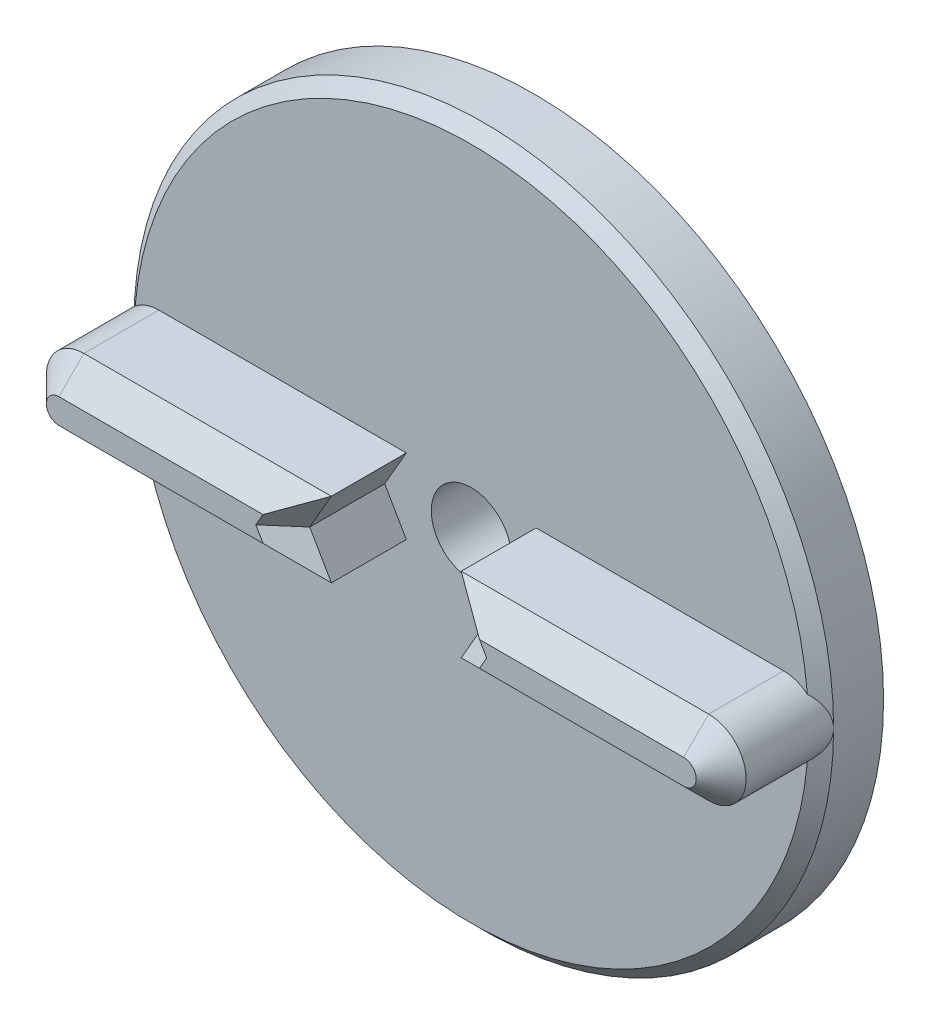
ISO-10303-21;
HEADER;
FILE_DESCRIPTION(('STEP AP214'),'2;1');
FILE_NAME('part.step','',(''),(''),'','','');
FILE_SCHEMA(('AUTOMOTIVE_DESIGN { 1 0 10303 214 1 1 1 1 }'));
ENDSEC;
DATA;
#1=APPLICATION_CONTEXT('core data for automotive mechanical design processes');
#2=APPLICATION_PROTOCOL_DEFINITION('international standard','automotive_design',2000,#1);
#3=PRODUCT_CONTEXT('',#1,'mechanical');
#4=PRODUCT('Part','Part','',(#3));
#5=PRODUCT_RELATED_PRODUCT_CATEGORY('part','',(#4));
#6=PRODUCT_DEFINITION_FORMATION('','',#4);
#7=PRODUCT_DEFINITION_CONTEXT('part definition',#1,'design');
#8=PRODUCT_DEFINITION('design','',#6,#7);
#9=PRODUCT_DEFINITION_SHAPE('','',#8);
#10=(LENGTH_UNIT() NAMED_UNIT(*) SI_UNIT(.MILLI.,.METRE.));
#11=(NAMED_UNIT(*) PLANE_ANGLE_UNIT() SI_UNIT($,.RADIAN.));
#12=(NAMED_UNIT(*) SI_UNIT($,.STERADIAN.) SOLID_ANGLE_UNIT());
#13=UNCERTAINTY_MEASURE_WITH_UNIT(LENGTH_MEASURE(1.E-05),#10,'distance_accuracy_value','');
#14=(GEOMETRIC_REPRESENTATION_CONTEXT(3) GLOBAL_UNCERTAINTY_ASSIGNED_CONTEXT((#13)) GLOBAL_UNIT_ASSIGNED_CONTEXT((#10,
#11,#12)) REPRESENTATION_CONTEXT('',''));
#15=CARTESIAN_POINT('',(0.,0.,0.));
#16=DIRECTION('',(0.,0.,1.));
#17=DIRECTION('',(1.,0.,0.));
#18=AXIS2_PLACEMENT_3D('',#15,#16,#17);
#19=CARTESIAN_POINT('',(0.,0.,-2.5));
#20=DIRECTION('',(0.,0.,1.));
#21=DIRECTION('',(1.,0.,0.));
#22=AXIS2_PLACEMENT_3D('',#19,#20,#21);
#23=CYLINDRICAL_SURFACE('',#22,1.6);
#24=DIRECTION('',(0.,0.,1.));
#25=VECTOR('',#24,1.);
#26=CARTESIAN_POINT('',(0.774596669241484,-1.4,-2.5));
#27=LINE('',#26,#25);
#28=CARTESIAN_POINT('',(0.774596669241484,-1.4,-2.));
#29=VERTEX_POINT('',#28);
#30=CARTESIAN_POINT('',(0.774596669241484,-1.4,0.));
#31=VERTEX_POINT('',#30);
#32=EDGE_CURVE('E258',#29,#31,#27,.T.);
#33=ORIENTED_EDGE('',*,*,#32,.T.);
#34=CARTESIAN_POINT('',(0.,0.,0.));
#35=DIRECTION('',(0.,0.,1.));
#36=DIRECTION('',(1.,0.,0.));
#37=AXIS2_PLACEMENT_3D('',#34,#35,#36);
#38=CIRCLE('',#37,1.6);
#39=CARTESIAN_POINT('',(-0.774596669241484,-1.4,0.));
#40=VERTEX_POINT('',#39);
#41=EDGE_CURVE('E257',#31,#40,#38,.F.);
#42=ORIENTED_EDGE('',*,*,#41,.T.);
#43=DIRECTION('',(0.,0.,1.));
#44=VECTOR('',#43,1.);
#45=CARTESIAN_POINT('',(-0.774596669241484,-1.4,-2.5));
#46=LINE('',#45,#44);
#47=CARTESIAN_POINT('',(-0.774596669241484,-1.4,-2.));
#48=VERTEX_POINT('',#47);
#49=EDGE_CURVE('E251',#40,#48,#46,.F.);
#50=ORIENTED_EDGE('',*,*,#49,.T.);
#51=CARTESIAN_POINT('',(0.,0.,-2.));
#52=DIRECTION('',(0.,0.,-1.));
#53=DIRECTION('',(-1.,0.,0.));
#54=AXIS2_PLACEMENT_3D('',#51,#52,#53);
#55=CIRCLE('',#54,1.6);
#56=CARTESIAN_POINT('',(-0.774596669241483,1.4,-2.));
#57=VERTEX_POINT('',#56);
#58=EDGE_CURVE('E390',#57,#48,#55,.F.);
#59=ORIENTED_EDGE('',*,*,#58,.F.);
#60=DIRECTION('',(0.,0.,1.));
#61=VECTOR('',#60,1.);
#62=CARTESIAN_POINT('',(-0.774596669241483,1.4,-2.5));
#63=LINE('',#62,#61);
#64=CARTESIAN_POINT('',(-0.774596669241483,1.4,0.));
#65=VERTEX_POINT('',#64);
#66=EDGE_CURVE('E253',#57,#65,#63,.T.);
#67=ORIENTED_EDGE('',*,*,#66,.T.);
#68=CARTESIAN_POINT('',(0.774596669241483,1.4,0.));
#69=VERTEX_POINT('',#68);
#70=EDGE_CURVE('E255',#65,#69,#38,.F.);
#71=ORIENTED_EDGE('',*,*,#70,.T.);
#72=DIRECTION('',(0.,0.,1.));
#73=VECTOR('',#72,1.);
#74=CARTESIAN_POINT('',(0.774596669241483,1.4,-2.5));
#75=LINE('',#74,#73);
#76=CARTESIAN_POINT('',(0.774596669241483,1.4,-2.));
#77=VERTEX_POINT('',#76);
#78=EDGE_CURVE('E260',#69,#77,#75,.F.);
#79=ORIENTED_EDGE('',*,*,#78,.T.);
#80=EDGE_CURVE('E393',#29,#77,#55,.F.);
#81=ORIENTED_EDGE('',*,*,#80,.F.);
#82=EDGE_LOOP('',(#33,#42,#50,#59,#67,#71,#79,#81));
#83=FACE_BOUND('',#82,.T.);
#84=CARTESIAN_POINT('',(0.,0.,2.5));
#85=DIRECTION('',(0.,0.,1.));
#86=DIRECTION('',(1.,0.,0.));
#87=AXIS2_PLACEMENT_3D('',#84,#85,#86);
#88=CIRCLE('',#87,1.6);
#89=CARTESIAN_POINT('',(1.6,0.,2.5));
#90=VERTEX_POINT('',#89);
#91=EDGE_CURVE('E262',#90,#90,#88,.F.);
#92=ORIENTED_EDGE('',*,*,#91,.F.);
#93=EDGE_LOOP('',(#92));
#94=FACE_BOUND('',#93,.T.);
#95=ADVANCED_FACE('F32',(#83,#94),#23,.F.);
#96=CARTESIAN_POINT('',(-12.5,-1.5,6.5));
#97=DIRECTION('',(0.,1.,0.));
#98=DIRECTION('',(-1.,0.,0.));
#99=AXIS2_PLACEMENT_3D('',#96,#97,#98);
#100=PLANE('',#99);
#101=DIRECTION('',(0.,0.,1.));
#102=VECTOR('',#101,1.);
#103=CARTESIAN_POINT('',(-2.59807621135332,-1.5,6.5));
#104=LINE('',#103,#102);
#105=CARTESIAN_POINT('',(-2.59807621135332,-1.5,2.5));
#106=VERTEX_POINT('',#105);
#107=CARTESIAN_POINT('',(-2.59807621135332,-1.5,5.5));
#108=VERTEX_POINT('',#107);
#109=EDGE_CURVE('E246',#106,#108,#104,.T.);
#110=ORIENTED_EDGE('',*,*,#109,.T.);
#111=DIRECTION('',(-1.,0.,0.));
#112=VECTOR('',#111,1.);
#113=CARTESIAN_POINT('',(-12.5,-1.5,5.5));
#114=LINE('',#113,#112);
#115=CARTESIAN_POINT('',(-12.5,-1.5,5.5));
#116=VERTEX_POINT('',#115);
#117=EDGE_CURVE('E425',#108,#116,#114,.T.);
#118=ORIENTED_EDGE('',*,*,#117,.T.);
#119=DIRECTION('',(0.,0.,-1.));
#120=VECTOR('',#119,1.);
#121=CARTESIAN_POINT('',(-12.5,-1.5,6.5));
#122=LINE('',#121,#120);
#123=CARTESIAN_POINT('',(-12.5,-1.5,2.5));
#124=VERTEX_POINT('',#123);
#125=EDGE_CURVE('E324',#116,#124,#122,.T.);
#126=ORIENTED_EDGE('',*,*,#125,.T.);
#127=DIRECTION('',(1.,0.,0.));
#128=VECTOR('',#127,1.);
#129=CARTESIAN_POINT('',(-12.5,-1.5,2.5));
#130=LINE('',#129,#128);
#131=EDGE_CURVE('E308',#124,#106,#130,.T.);
#132=ORIENTED_EDGE('',*,*,#131,.T.);
#133=EDGE_LOOP('',(#110,#118,#126,#132));
#134=FACE_BOUND('',#133,.T.);
#135=ADVANCED_FACE('F475',(#134),#100,.F.);
#136=DIRECTION('',(0.,0.,-1.));
#137=VECTOR('',#136,1.);
#138=CARTESIAN_POINT('',(12.5,-1.5,6.5));
#139=LINE('',#138,#137);
#140=CARTESIAN_POINT('',(12.5,-1.5,5.5));
#141=VERTEX_POINT('',#140);
#142=CARTESIAN_POINT('',(12.5,-1.5,2.5));
#143=VERTEX_POINT('',#142);
#144=EDGE_CURVE('E322',#141,#143,#139,.T.);
#145=ORIENTED_EDGE('',*,*,#144,.F.);
#146=DIRECTION('',(-1.,0.,0.));
#147=VECTOR('',#146,1.);
#148=CARTESIAN_POINT('',(2.59807621135332,-1.5,5.5));
#149=LINE('',#148,#147);
#150=CARTESIAN_POINT('',(2.59807621135332,-1.5,5.5));
#151=VERTEX_POINT('',#150);
#152=EDGE_CURVE('E411',#141,#151,#149,.T.);
#153=ORIENTED_EDGE('',*,*,#152,.T.);
#154=DIRECTION('',(0.,0.,-1.));
#155=VECTOR('',#154,1.);
#156=CARTESIAN_POINT('',(2.59807621135332,-1.5,6.5));
#157=LINE('',#156,#155);
#158=CARTESIAN_POINT('',(2.59807621135332,-1.5,2.5));
#159=VERTEX_POINT('',#158);
#160=EDGE_CURVE('E244',#151,#159,#157,.T.);
#161=ORIENTED_EDGE('',*,*,#160,.T.);
#162=EDGE_CURVE('E226',#159,#143,#130,.T.);
#163=ORIENTED_EDGE('',*,*,#162,.T.);
#164=EDGE_LOOP('',(#145,#153,#161,#163));
#165=FACE_BOUND('',#164,.T.);
#166=ADVANCED_FACE('F521',(#165),#100,.F.);
#167=CARTESIAN_POINT('',(-12.5,1.5,6.5));
#168=DIRECTION('',(0.,-1.,0.));
#169=DIRECTION('',(1.,0.,0.));
#170=AXIS2_PLACEMENT_3D('',#167,#168,#169);
#171=PLANE('',#170);
#172=DIRECTION('',(0.,0.,1.));
#173=VECTOR('',#172,1.);
#174=CARTESIAN_POINT('',(2.59807621135331,1.5,6.5));
#175=LINE('',#174,#173);
#176=CARTESIAN_POINT('',(2.59807621135331,1.5,2.5));
#177=VERTEX_POINT('',#176);
#178=CARTESIAN_POINT('',(2.59807621135331,1.5,5.5));
#179=VERTEX_POINT('',#178);
#180=EDGE_CURVE('E215',#177,#179,#175,.T.);
#181=ORIENTED_EDGE('',*,*,#180,.T.);
#182=DIRECTION('',(1.,0.,0.));
#183=VECTOR('',#182,1.);
#184=CARTESIAN_POINT('',(12.5,1.5,5.5));
#185=LINE('',#184,#183);
#186=CARTESIAN_POINT('',(12.5,1.5,5.5));
#187=VERTEX_POINT('',#186);
#188=EDGE_CURVE('E407',#179,#187,#185,.T.);
#189=ORIENTED_EDGE('',*,*,#188,.T.);
#190=DIRECTION('',(0.,0.,-1.));
#191=VECTOR('',#190,1.);
#192=CARTESIAN_POINT('',(12.5,1.5,6.5));
#193=LINE('',#192,#191);
#194=CARTESIAN_POINT('',(12.5,1.5,2.5));
#195=VERTEX_POINT('',#194);
#196=EDGE_CURVE('E320',#187,#195,#193,.T.);
#197=ORIENTED_EDGE('',*,*,#196,.T.);
#198=DIRECTION('',(-1.,0.,0.));
#199=VECTOR('',#198,1.);
#200=CARTESIAN_POINT('',(-12.5,1.5,2.5));
#201=LINE('',#200,#199);
#202=EDGE_CURVE('E316',#195,#177,#201,.T.);
#203=ORIENTED_EDGE('',*,*,#202,.T.);
#204=EDGE_LOOP('',(#181,#189,#197,#203));
#205=FACE_BOUND('',#204,.T.);
#206=ADVANCED_FACE('F548',(#205),#171,.F.);
#207=DIRECTION('',(0.,0.,-1.));
#208=VECTOR('',#207,1.);
#209=CARTESIAN_POINT('',(-12.5,1.5,6.5));
#210=LINE('',#209,#208);
#211=CARTESIAN_POINT('',(-12.5,1.5,5.5));
#212=VERTEX_POINT('',#211);
#213=CARTESIAN_POINT('',(-12.5,1.5,2.5));
#214=VERTEX_POINT('',#213);
#215=EDGE_CURVE('E318',#212,#214,#210,.T.);
#216=ORIENTED_EDGE('',*,*,#215,.F.);
#217=DIRECTION('',(1.,0.,0.));
#218=VECTOR('',#217,1.);
#219=CARTESIAN_POINT('',(-2.59807621135331,1.5,5.5));
#220=LINE('',#219,#218);
#221=CARTESIAN_POINT('',(-2.59807621135331,1.5,5.5));
#222=VERTEX_POINT('',#221);
#223=EDGE_CURVE('E56',#212,#222,#220,.T.);
#224=ORIENTED_EDGE('',*,*,#223,.T.);
#225=DIRECTION('',(0.,0.,-1.));
#226=VECTOR('',#225,1.);
#227=CARTESIAN_POINT('',(-2.59807621135331,1.5,6.5));
#228=LINE('',#227,#226);
#229=CARTESIAN_POINT('',(-2.59807621135332,1.5,2.5));
#230=VERTEX_POINT('',#229);
#231=EDGE_CURVE('E249',#222,#230,#228,.T.);
#232=ORIENTED_EDGE('',*,*,#231,.T.);
#233=EDGE_CURVE('E314',#230,#214,#201,.T.);
#234=ORIENTED_EDGE('',*,*,#233,.T.);
#235=EDGE_LOOP('',(#216,#224,#232,#234));
#236=FACE_BOUND('',#235,.T.);
#237=ADVANCED_FACE('F484',(#236),#171,.F.);
#238=CARTESIAN_POINT('',(-12.5,0.,6.5));
#239=DIRECTION('',(0.,0.,1.));
#240=DIRECTION('',(1.,0.,0.));
#241=AXIS2_PLACEMENT_3D('',#238,#239,#240);
#242=PLANE('',#241);
#243=CARTESIAN_POINT('',(-12.5,0.,6.5));
#244=DIRECTION('',(0.,0.,1.));
#245=DIRECTION('',(1.,0.,0.));
#246=AXIS2_PLACEMENT_3D('',#243,#244,#245);
#247=CIRCLE('',#246,0.499999999999995);
#248=CARTESIAN_POINT('',(-12.5,0.499999999999995,6.5));
#249=VERTEX_POINT('',#248);
#250=CARTESIAN_POINT('',(-12.5,-0.5,6.5));
#251=VERTEX_POINT('',#250);
#252=EDGE_CURVE('E420',#249,#251,#247,.T.);
#253=ORIENTED_EDGE('',*,*,#252,.T.);
#254=DIRECTION('',(1.,0.,0.));
#255=VECTOR('',#254,1.);
#256=CARTESIAN_POINT('',(-2.59807621135331,-0.499999999999993,6.5));
#257=LINE('',#256,#255);
#258=CARTESIAN_POINT('',(-4.3301270189222,-0.499999999999994,6.5));
#259=VERTEX_POINT('',#258);
#260=EDGE_CURVE('E422',#251,#259,#257,.T.);
#261=ORIENTED_EDGE('',*,*,#260,.T.);
#262=DIRECTION('',(-0.5,0.866025403784439,0.));
#263=VECTOR('',#262,1.);
#264=CARTESIAN_POINT('',(-4.3301270189222,-0.500000000000002,6.5));
#265=LINE('',#264,#263);
#266=CARTESIAN_POINT('',(-4.61880215351701,0.,6.5));
#267=VERTEX_POINT('',#266);
#268=EDGE_CURVE('E414',#259,#267,#265,.T.);
#269=ORIENTED_EDGE('',*,*,#268,.T.);
#270=DIRECTION('',(0.5,0.866025403784439,0.));
#271=VECTOR('',#270,1.);
#272=CARTESIAN_POINT('',(-3.46410161513776,2.00000000000001,6.5));
#273=LINE('',#272,#271);
#274=CARTESIAN_POINT('',(-4.3301270189222,0.499999999999997,6.5));
#275=VERTEX_POINT('',#274);
#276=EDGE_CURVE('E416',#267,#275,#273,.T.);
#277=ORIENTED_EDGE('',*,*,#276,.T.);
#278=DIRECTION('',(-1.,0.,0.));
#279=VECTOR('',#278,1.);
#280=CARTESIAN_POINT('',(-12.5,0.499999999999995,6.5));
#281=LINE('',#280,#279);
#282=EDGE_CURVE('E418',#275,#249,#281,.T.);
#283=ORIENTED_EDGE('',*,*,#282,.T.);
#284=EDGE_LOOP('',(#253,#261,#269,#277,#283));
#285=FACE_BOUND('',#284,.T.);
#286=ADVANCED_FACE('F462',(#285),#242,.T.);
#287=CARTESIAN_POINT('',(4.4,1.4,-2.));
#288=DIRECTION('',(0.,-1.,0.));
#289=DIRECTION('',(0.,0.,-1.));
#290=AXIS2_PLACEMENT_3D('',#287,#288,#289);
#291=PLANE('',#290);
#292=ORIENTED_EDGE('',*,*,#78,.F.);
#293=DIRECTION('',(1.,0.,0.));
#294=VECTOR('',#293,1.);
#295=CARTESIAN_POINT('',(4.4,1.4,0.));
#296=LINE('',#295,#294);
#297=CARTESIAN_POINT('',(4.4,1.4,0.));
#298=VERTEX_POINT('',#297);
#299=EDGE_CURVE('E283',#69,#298,#296,.T.);
#300=ORIENTED_EDGE('',*,*,#299,.T.);
#301=DIRECTION('',(0.,0.,1.));
#302=VECTOR('',#301,1.);
#303=CARTESIAN_POINT('',(4.4,1.4,-2.));
#304=LINE('',#303,#302);
#305=CARTESIAN_POINT('',(4.4,1.4,-2.));
#306=VERTEX_POINT('',#305);
#307=EDGE_CURVE('E298',#306,#298,#304,.T.);
#308=ORIENTED_EDGE('',*,*,#307,.F.);
#309=DIRECTION('',(1.,0.,0.));
#310=VECTOR('',#309,1.);
#311=CARTESIAN_POINT('',(4.4,1.4,-2.));
#312=LINE('',#311,#310);
#313=EDGE_CURVE('E269',#77,#306,#312,.T.);
#314=ORIENTED_EDGE('',*,*,#313,.F.);
#315=EDGE_LOOP('',(#292,#300,#308,#314));
#316=FACE_BOUND('',#315,.T.);
#317=ADVANCED_FACE('F537',(#316),#291,.F.);
#318=ORIENTED_EDGE('',*,*,#66,.F.);
#319=CARTESIAN_POINT('',(-4.4,1.4,-2.));
#320=VERTEX_POINT('',#319);
#321=EDGE_CURVE('E271',#320,#57,#312,.T.);
#322=ORIENTED_EDGE('',*,*,#321,.F.);
#323=DIRECTION('',(0.,0.,1.));
#324=VECTOR('',#323,1.);
#325=CARTESIAN_POINT('',(-4.4,1.4,-2.));
#326=LINE('',#325,#324);
#327=CARTESIAN_POINT('',(-4.4,1.4,0.));
#328=VERTEX_POINT('',#327);
#329=EDGE_CURVE('E301',#320,#328,#326,.T.);
#330=ORIENTED_EDGE('',*,*,#329,.T.);
#331=EDGE_CURVE('E284',#328,#65,#296,.T.);
#332=ORIENTED_EDGE('',*,*,#331,.T.);
#333=EDGE_LOOP('',(#318,#322,#330,#332));
#334=FACE_BOUND('',#333,.T.);
#335=ADVANCED_FACE('F532',(#334),#291,.F.);
#336=CARTESIAN_POINT('',(4.4,-1.4,-2.));
#337=DIRECTION('',(0.,1.,0.));
#338=DIRECTION('',(0.,0.,1.));
#339=AXIS2_PLACEMENT_3D('',#336,#337,#338);
#340=PLANE('',#339);
#341=ORIENTED_EDGE('',*,*,#49,.F.);
#342=DIRECTION('',(-1.,0.,0.));
#343=VECTOR('',#342,1.);
#344=CARTESIAN_POINT('',(4.4,-1.4,0.));
#345=LINE('',#344,#343);
#346=CARTESIAN_POINT('',(-4.4,-1.4,0.));
#347=VERTEX_POINT('',#346);
#348=EDGE_CURVE('E290',#40,#347,#345,.T.);
#349=ORIENTED_EDGE('',*,*,#348,.T.);
#350=DIRECTION('',(0.,0.,1.));
#351=VECTOR('',#350,1.);
#352=CARTESIAN_POINT('',(-4.4,-1.4,-2.));
#353=LINE('',#352,#351);
#354=CARTESIAN_POINT('',(-4.4,-1.4,-2.));
#355=VERTEX_POINT('',#354);
#356=EDGE_CURVE('E280',#355,#347,#353,.T.);
#357=ORIENTED_EDGE('',*,*,#356,.F.);
#358=DIRECTION('',(-1.,0.,0.));
#359=VECTOR('',#358,1.);
#360=CARTESIAN_POINT('',(4.4,-1.4,-2.));
#361=LINE('',#360,#359);
#362=EDGE_CURVE('E276',#48,#355,#361,.T.);
#363=ORIENTED_EDGE('',*,*,#362,.F.);
#364=EDGE_LOOP('',(#341,#349,#357,#363));
#365=FACE_BOUND('',#364,.T.);
#366=ADVANCED_FACE('F529',(#365),#340,.F.);
#367=ORIENTED_EDGE('',*,*,#32,.F.);
#368=CARTESIAN_POINT('',(4.4,-1.4,-2.));
#369=VERTEX_POINT('',#368);
#370=EDGE_CURVE('E277',#369,#29,#361,.T.);
#371=ORIENTED_EDGE('',*,*,#370,.F.);
#372=DIRECTION('',(0.,0.,1.));
#373=VECTOR('',#372,1.);
#374=CARTESIAN_POINT('',(4.4,-1.4,-2.));
#375=LINE('',#374,#373);
#376=CARTESIAN_POINT('',(4.4,-1.4,0.));
#377=VERTEX_POINT('',#376);
#378=EDGE_CURVE('E295',#369,#377,#375,.T.);
#379=ORIENTED_EDGE('',*,*,#378,.T.);
#380=EDGE_CURVE('E270',#377,#31,#345,.T.);
#381=ORIENTED_EDGE('',*,*,#380,.T.);
#382=EDGE_LOOP('',(#367,#371,#379,#381));
#383=FACE_BOUND('',#382,.T.);
#384=ADVANCED_FACE('F510',(#383),#340,.F.);
#385=CARTESIAN_POINT('',(0.,0.,-2.));
#386=DIRECTION('',(0.,0.,-1.));
#387=DIRECTION('',(-1.,0.,0.));
#388=AXIS2_PLACEMENT_3D('',#385,#386,#387);
#389=PLANE('',#388);
#390=ORIENTED_EDGE('',*,*,#370,.T.);
#391=ORIENTED_EDGE('',*,*,#80,.T.);
#392=ORIENTED_EDGE('',*,*,#313,.T.);
#393=DIRECTION('',(0.,-1.,0.));
#394=VECTOR('',#393,1.);
#395=CARTESIAN_POINT('',(4.4,1.4,-2.));
#396=LINE('',#395,#394);
#397=EDGE_CURVE('E274',#306,#369,#396,.T.);
#398=ORIENTED_EDGE('',*,*,#397,.T.);
#399=EDGE_LOOP('',(#390,#391,#392,#398));
#400=FACE_BOUND('',#399,.T.);
#401=ADVANCED_FACE('F505',(#400),#389,.T.);
#402=CARTESIAN_POINT('',(0.,0.,0.));
#403=DIRECTION('',(0.,0.,1.));
#404=DIRECTION('',(1.,0.,0.));
#405=AXIS2_PLACEMENT_3D('',#402,#403,#404);
#406=PLANE('',#405);
#407=ORIENTED_EDGE('',*,*,#41,.F.);
#408=ORIENTED_EDGE('',*,*,#380,.F.);
#409=DIRECTION('',(0.,-1.,0.));
#410=VECTOR('',#409,1.);
#411=CARTESIAN_POINT('',(4.4,1.4,0.));
#412=LINE('',#411,#410);
#413=EDGE_CURVE('E287',#298,#377,#412,.T.);
#414=ORIENTED_EDGE('',*,*,#413,.F.);
#415=ORIENTED_EDGE('',*,*,#299,.F.);
#416=ORIENTED_EDGE('',*,*,#70,.F.);
#417=ORIENTED_EDGE('',*,*,#331,.F.);
#418=DIRECTION('',(0.,1.,0.));
#419=VECTOR('',#418,1.);
#420=CARTESIAN_POINT('',(-4.4,1.4,0.));
#421=LINE('',#420,#419);
#422=EDGE_CURVE('E265',#347,#328,#421,.T.);
#423=ORIENTED_EDGE('',*,*,#422,.F.);
#424=ORIENTED_EDGE('',*,*,#348,.F.);
#425=EDGE_LOOP('',(#407,#408,#414,#415,#416,#417,#423,#424));
#426=FACE_BOUND('',#425,.T.);
#427=CARTESIAN_POINT('',(0.,0.,0.));
#428=DIRECTION('',(0.,0.,1.));
#429=DIRECTION('',(1.,0.,0.));
#430=AXIS2_PLACEMENT_3D('',#427,#428,#429);
#431=CIRCLE('',#430,14.);
#432=CARTESIAN_POINT('',(14.,0.,0.));
#433=VERTEX_POINT('',#432);
#434=EDGE_CURVE('E326',#433,#433,#431,.T.);
#435=ORIENTED_EDGE('',*,*,#434,.F.);
#436=EDGE_LOOP('',(#435));
#437=FACE_BOUND('',#436,.T.);
#438=ADVANCED_FACE('F501',(#426,#437),#406,.F.);
#439=CARTESIAN_POINT('',(0.,0.,2.5));
#440=DIRECTION('',(0.,0.,-1.));
#441=DIRECTION('',(-1.,0.,0.));
#442=AXIS2_PLACEMENT_3D('',#439,#440,#441);
#443=CYLINDRICAL_SURFACE('',#442,14.);
#444=CARTESIAN_POINT('',(0.,0.,2.));
#445=DIRECTION('',(0.,0.,1.));
#446=DIRECTION('',(1.,0.,0.));
#447=AXIS2_PLACEMENT_3D('',#444,#445,#446);
#448=CIRCLE('',#447,14.);
#449=CARTESIAN_POINT('',(14.,0.,2.));
#450=VERTEX_POINT('',#449);
#451=CARTESIAN_POINT('',(-14.,0.,2.));
#452=VERTEX_POINT('',#451);
#453=EDGE_CURVE('E332',#450,#452,#448,.F.);
#454=ORIENTED_EDGE('',*,*,#453,.T.);
#455=CARTESIAN_POINT('',(0.,0.,2.));
#456=DIRECTION('',(0.,0.,1.));
#457=DIRECTION('',(1.,0.,0.));
#458=AXIS2_PLACEMENT_3D('',#455,#456,#457);
#459=CIRCLE('',#458,14.);
#460=EDGE_CURVE('E334',#452,#450,#459,.F.);
#461=ORIENTED_EDGE('',*,*,#460,.T.);
#462=EDGE_LOOP('',(#454,#461));
#463=FACE_BOUND('',#462,.T.);
#464=ORIENTED_EDGE('',*,*,#434,.T.);
#465=EDGE_LOOP('',(#464));
#466=FACE_BOUND('',#465,.T.);
#467=ADVANCED_FACE('F367',(#463,#466),#443,.T.);
#468=CARTESIAN_POINT('',(0.,0.,2.5));
#469=DIRECTION('',(0.,0.,1.));
#470=DIRECTION('',(1.,0.,0.));
#471=AXIS2_PLACEMENT_3D('',#468,#469,#470);
#472=PLANE('',#471);
#473=ORIENTED_EDGE('',*,*,#91,.T.);
#474=EDGE_LOOP('',(#473));
#475=FACE_BOUND('',#474,.T.);
#476=ORIENTED_EDGE('',*,*,#162,.F.);
#477=DIRECTION('',(-0.5,-0.866025403784439,0.));
#478=VECTOR('',#477,1.);
#479=CARTESIAN_POINT('',(1.73205080756888,-3.,2.5));
#480=LINE('',#479,#478);
#481=CARTESIAN_POINT('',(3.46410161513776,0.,2.5));
#482=VERTEX_POINT('',#481);
#483=EDGE_CURVE('E219',#482,#159,#480,.T.);
#484=ORIENTED_EDGE('',*,*,#483,.F.);
#485=DIRECTION('',(0.5,-0.866025403784438,0.));
#486=VECTOR('',#485,1.);
#487=CARTESIAN_POINT('',(3.46410161513776,0.,2.5));
#488=LINE('',#487,#486);
#489=EDGE_CURVE('E207',#177,#482,#488,.T.);
#490=ORIENTED_EDGE('',*,*,#489,.F.);
#491=ORIENTED_EDGE('',*,*,#202,.F.);
#492=CARTESIAN_POINT('',(12.5,0.,2.5));
#493=DIRECTION('',(0.,0.,1.));
#494=DIRECTION('',(1.,0.,0.));
#495=AXIS2_PLACEMENT_3D('',#492,#493,#494);
#496=CIRCLE('',#495,1.5);
#497=CARTESIAN_POINT('',(13.45,1.16081867662438,2.5));
#498=VERTEX_POINT('',#497);
#499=EDGE_CURVE('E315',#498,#195,#496,.T.);
#500=ORIENTED_EDGE('',*,*,#499,.F.);
#501=CARTESIAN_POINT('',(0.,0.,2.5));
#502=DIRECTION('',(0.,0.,1.));
#503=DIRECTION('',(1.,0.,0.));
#504=AXIS2_PLACEMENT_3D('',#501,#502,#503);
#505=CIRCLE('',#504,13.5);
#506=CARTESIAN_POINT('',(-13.45,1.16081867662438,2.5));
#507=VERTEX_POINT('',#506);
#508=EDGE_CURVE('E329',#498,#507,#505,.T.);
#509=ORIENTED_EDGE('',*,*,#508,.T.);
#510=CARTESIAN_POINT('',(-12.5,0.,2.5));
#511=DIRECTION('',(0.,0.,1.));
#512=DIRECTION('',(1.,0.,0.));
#513=AXIS2_PLACEMENT_3D('',#510,#511,#512);
#514=CIRCLE('',#513,1.5);
#515=EDGE_CURVE('E304',#214,#507,#514,.T.);
#516=ORIENTED_EDGE('',*,*,#515,.F.);
#517=ORIENTED_EDGE('',*,*,#233,.F.);
#518=DIRECTION('',(0.5,0.866025403784439,0.));
#519=VECTOR('',#518,1.);
#520=CARTESIAN_POINT('',(-1.73205080756888,3.,2.5));
#521=LINE('',#520,#519);
#522=CARTESIAN_POINT('',(-3.46410161513776,0.,2.5));
#523=VERTEX_POINT('',#522);
#524=EDGE_CURVE('E237',#523,#230,#521,.T.);
#525=ORIENTED_EDGE('',*,*,#524,.F.);
#526=DIRECTION('',(-0.5,0.866025403784438,0.));
#527=VECTOR('',#526,1.);
#528=CARTESIAN_POINT('',(-3.46410161513776,0.,2.5));
#529=LINE('',#528,#527);
#530=EDGE_CURVE('E229',#106,#523,#529,.T.);
#531=ORIENTED_EDGE('',*,*,#530,.F.);
#532=ORIENTED_EDGE('',*,*,#131,.F.);
#533=CARTESIAN_POINT('',(-13.45,-1.16081867662439,2.5));
#534=VERTEX_POINT('',#533);
#535=EDGE_CURVE('E307',#534,#124,#514,.T.);
#536=ORIENTED_EDGE('',*,*,#535,.F.);
#537=CARTESIAN_POINT('',(0.,0.,2.5));
#538=DIRECTION('',(0.,0.,1.));
#539=DIRECTION('',(1.,0.,0.));
#540=AXIS2_PLACEMENT_3D('',#537,#538,#539);
#541=CIRCLE('',#540,13.5);
#542=CARTESIAN_POINT('',(13.45,-1.16081867662439,2.5));
#543=VERTEX_POINT('',#542);
#544=EDGE_CURVE('E337',#534,#543,#541,.T.);
#545=ORIENTED_EDGE('',*,*,#544,.T.);
#546=EDGE_CURVE('E311',#143,#543,#496,.T.);
#547=ORIENTED_EDGE('',*,*,#546,.F.);
#548=EDGE_LOOP('',(#476,#484,#490,#491,#500,#509,#516,#517,#525,#531,#532,#536,#545,#547));
#549=FACE_BOUND('',#548,.T.);
#550=ADVANCED_FACE('F223',(#475,#549),#472,.T.);
#551=CARTESIAN_POINT('',(-12.5,0.,6.5));
#552=DIRECTION('',(0.,0.,-1.));
#553=DIRECTION('',(-1.,0.,0.));
#554=AXIS2_PLACEMENT_3D('',#551,#552,#553);
#555=CYLINDRICAL_SURFACE('',#554,1.5);
#556=ORIENTED_EDGE('',*,*,#125,.F.);
#557=CARTESIAN_POINT('',(-12.5,0.,5.5));
#558=DIRECTION('',(0.,0.,1.));
#559=DIRECTION('',(1.,0.,0.));
#560=AXIS2_PLACEMENT_3D('',#557,#558,#559);
#561=CIRCLE('',#560,1.5);
#562=EDGE_CURVE('E428',#116,#212,#561,.F.);
#563=ORIENTED_EDGE('',*,*,#562,.T.);
#564=ORIENTED_EDGE('',*,*,#215,.T.);
#565=ORIENTED_EDGE('',*,*,#515,.T.);
#566=CARTESIAN_POINT('',(-13.45,1.16081867662438,2.5));
#567=CARTESIAN_POINT('',(-13.5076598187642,1.11366112025403,2.4465998064039));
#568=CARTESIAN_POINT('',(-13.5633478988301,1.06087401598492,2.39536557396655));
#569=CARTESIAN_POINT('',(-13.6687383925226,0.943568862092817,2.29887838065303));
#570=CARTESIAN_POINT('',(-13.7183722535958,0.878934105931742,2.25369344110848));
#571=CARTESIAN_POINT('',(-13.7993579041721,0.752418120651807,2.18026651034321));
#572=CARTESIAN_POINT('',(-13.8323825020416,0.692544987066488,2.15044208122235));
#573=CARTESIAN_POINT('',(-13.8905897743329,0.566590592146235,2.09800636125915));
#574=CARTESIAN_POINT('',(-13.9158215360136,0.500551751890484,2.07534989624048));
#575=CARTESIAN_POINT('',(-13.9466618063629,0.398042728389589,2.04770166184555));
#576=CARTESIAN_POINT('',(-13.9557547958397,0.363421696517411,2.03955875654101));
#577=CARTESIAN_POINT('',(-13.9715075655969,0.293187066692263,2.02546105603809));
#578=CARTESIAN_POINT('',(-13.9781676744698,0.257573603480082,2.01950596534584));
#579=CARTESIAN_POINT('',(-13.9889817186279,0.185173137452579,2.00984031232124));
#580=CARTESIAN_POINT('',(-13.9931011100469,0.148376823394768,2.00616068574643));
#581=CARTESIAN_POINT('',(-13.9986166413288,0.0743896705555953,2.00123515600297));
#582=CARTESIAN_POINT('',(-14.000010548342,0.037198533371421,1.99999124829273));
#583=CARTESIAN_POINT('',(-14.,0.,2.));
#584=B_SPLINE_CURVE_WITH_KNOTS('',3,(#566,#567,#568,#569,#570,#571,#572,#573,#574,#575,#576,
#577,#578,#579,#580,#581,#582,#583),.UNSPECIFIED.,.F.,.F.,(4,2,2,2,2,2,2,2,4),(0.,
0.275374789815084,0.553624205503762,0.776545050604598,0.998031640375285,1.10802783367121,
1.21800916503127,1.32945462729297,1.4409913529179),.UNSPECIFIED.);
#585=EDGE_CURVE('E339',#507,#452,#584,.T.);
#586=ORIENTED_EDGE('',*,*,#585,.T.);
#587=CARTESIAN_POINT('',(-14.,0.,2.));
#588=CARTESIAN_POINT('',(-14.0000079589044,-0.0346518871804854,1.99999339891276));
#589=CARTESIAN_POINT('',(-13.9987995000734,-0.0692983823576636,2.00107188652944));
#590=CARTESIAN_POINT('',(-13.9940108096556,-0.138274396038903,2.00534821589976));
#591=CARTESIAN_POINT('',(-13.9904320568889,-0.172604098657093,2.00854473621904));
#592=CARTESIAN_POINT('',(-13.9810192893378,-0.240284552036894,2.01695674618978));
#593=CARTESIAN_POINT('',(-13.9752122486481,-0.2736420644133,2.02214808893144));
#594=CARTESIAN_POINT('',(-13.9614534229645,-0.33954202993416,2.03445763656254));
#595=CARTESIAN_POINT('',(-13.9535014289675,-0.372084403314036,2.04157602922293));
#596=CARTESIAN_POINT('',(-13.9266542651401,-0.468025932060092,2.06563189920305));
#597=CARTESIAN_POINT('',(-13.9047389689987,-0.529939977861675,2.08529584286127));
#598=CARTESIAN_POINT('',(-13.8540089761031,-0.648750043613422,2.13094276173494));
#599=CARTESIAN_POINT('',(-13.8251522058424,-0.705612449883585,2.15696428707061));
#600=CARTESIAN_POINT('',(-13.745872441203,-0.840614269677904,2.22870195525572));
#601=CARTESIAN_POINT('',(-13.6919233477282,-0.914970347461068,2.27772283269153));
#602=CARTESIAN_POINT('',(-13.6049680074765,-1.0153821546266,2.3572398570077));
#603=CARTESIAN_POINT('',(-13.5751019563498,-1.04690043266498,2.38462827213986));
#604=CARTESIAN_POINT('',(-13.5137191757473,-1.10642869857616,2.44109976697109));
#605=CARTESIAN_POINT('',(-13.4822064773218,-1.13444673251668,2.47017872616955));
#606=CARTESIAN_POINT('',(-13.45,-1.16081867662439,2.5));
#607=B_SPLINE_CURVE_WITH_KNOTS('',3,(#587,#588,#589,#590,#591,#592,#593,#594,#595,#596,#597,
#598,#599,#600,#601,#602,#603,#604,#605,#606),.UNSPECIFIED.,.F.,.F.,(4,2,2,2,2,2,2,2,2,4),(0.,
0.103909015247125,0.207753262930284,0.310378198579914,0.413013137562354,0.61767847123457,
0.823617042640213,1.13370757890964,1.28759173805376,1.44111538470451),.UNSPECIFIED.);
#608=EDGE_CURVE('E384',#452,#534,#607,.T.);
#609=ORIENTED_EDGE('',*,*,#608,.T.);
#610=ORIENTED_EDGE('',*,*,#535,.T.);
#611=EDGE_LOOP('',(#556,#563,#564,#565,#586,#609,#610));
#612=FACE_BOUND('',#611,.T.);
#613=ADVANCED_FACE('F355',(#612),#555,.T.);
#614=CARTESIAN_POINT('',(12.5,0.,6.5));
#615=DIRECTION('',(0.,0.,-1.));
#616=DIRECTION('',(-1.,0.,0.));
#617=AXIS2_PLACEMENT_3D('',#614,#615,#616);
#618=CYLINDRICAL_SURFACE('',#617,1.5);
#619=ORIENTED_EDGE('',*,*,#196,.F.);
#620=CARTESIAN_POINT('',(12.5,0.,5.5));
#621=DIRECTION('',(0.,0.,1.));
#622=DIRECTION('',(1.,0.,0.));
#623=AXIS2_PLACEMENT_3D('',#620,#621,#622);
#624=CIRCLE('',#623,1.5);
#625=EDGE_CURVE('E409',#187,#141,#624,.F.);
#626=ORIENTED_EDGE('',*,*,#625,.T.);
#627=ORIENTED_EDGE('',*,*,#144,.T.);
#628=ORIENTED_EDGE('',*,*,#546,.T.);
#629=CARTESIAN_POINT('',(13.45,-1.16081867662439,2.5));
#630=CARTESIAN_POINT('',(13.5076598187642,-1.11366112025403,2.4465998064039));
#631=CARTESIAN_POINT('',(13.5633478988301,-1.06087401598493,2.39536557396655));
#632=CARTESIAN_POINT('',(13.6687383925226,-0.943568862092822,2.29887838065303));
#633=CARTESIAN_POINT('',(13.7183722535958,-0.878934105931746,2.25369344110848));
#634=CARTESIAN_POINT('',(13.7993579041721,-0.752418120651811,2.18026651034321));
#635=CARTESIAN_POINT('',(13.8323825020416,-0.692544987066492,2.15044208122235));
#636=CARTESIAN_POINT('',(13.8905897743329,-0.566590592146239,2.09800636125915));
#637=CARTESIAN_POINT('',(13.9158215360136,-0.500551751890489,2.07534989624048));
#638=CARTESIAN_POINT('',(13.9466618063629,-0.398042728389593,2.04770166184555));
#639=CARTESIAN_POINT('',(13.9557547958397,-0.363421696517416,2.03955875654101));
#640=CARTESIAN_POINT('',(13.9715075655969,-0.293187066692266,2.02546105603809));
#641=CARTESIAN_POINT('',(13.9781676744698,-0.257573603480084,2.01950596534584));
#642=CARTESIAN_POINT('',(13.9889817186279,-0.185173137452581,2.00984031232124));
#643=CARTESIAN_POINT('',(13.9931011100469,-0.148376823394769,2.00616068574643));
#644=CARTESIAN_POINT('',(13.9986166413288,-0.0743896705555949,2.00123515600297));
#645=CARTESIAN_POINT('',(14.000010548342,-0.0371985333714199,1.99999124829273));
#646=CARTESIAN_POINT('',(14.,0.,2.));
#647=B_SPLINE_CURVE_WITH_KNOTS('',3,(#629,#630,#631,#632,#633,#634,#635,#636,#637,#638,#639,
#640,#641,#642,#643,#644,#645,#646),.UNSPECIFIED.,.F.,.F.,(4,2,2,2,2,2,2,2,4),(0.,
0.275374789815083,0.553624205503761,0.776545050604598,0.998031640375284,1.10802783367121,
1.21800916503128,1.32945462729298,1.44099135291791),.UNSPECIFIED.);
#648=EDGE_CURVE('E378',#543,#450,#647,.T.);
#649=ORIENTED_EDGE('',*,*,#648,.T.);
#650=CARTESIAN_POINT('',(14.,0.,2.));
#651=CARTESIAN_POINT('',(14.0000079589044,0.0346518871804872,1.99999339891276));
#652=CARTESIAN_POINT('',(13.9987995000734,0.0692983823576656,2.00107188652944));
#653=CARTESIAN_POINT('',(13.9940108096556,0.138274396038905,2.00534821589976));
#654=CARTESIAN_POINT('',(13.9904320568889,0.172604098657095,2.00854473621904));
#655=CARTESIAN_POINT('',(13.9810192893378,0.240284552036896,2.01695674618978));
#656=CARTESIAN_POINT('',(13.9752122486481,0.273642064413302,2.02214808893144));
#657=CARTESIAN_POINT('',(13.9614534229645,0.339542029934163,2.03445763656254));
#658=CARTESIAN_POINT('',(13.9535014289675,0.372084403314038,2.04157602922293));
#659=CARTESIAN_POINT('',(13.9266542651401,0.468025932060094,2.06563189920305));
#660=CARTESIAN_POINT('',(13.9047389689987,0.529939977861676,2.08529584286127));
#661=CARTESIAN_POINT('',(13.8540089761031,0.648750043613424,2.13094276173494));
#662=CARTESIAN_POINT('',(13.8251522058424,0.705612449883587,2.15696428707061));
#663=CARTESIAN_POINT('',(13.745872441203,0.840614269677906,2.22870195525572));
#664=CARTESIAN_POINT('',(13.6919233477282,0.914970347461067,2.27772283269154));
#665=CARTESIAN_POINT('',(13.6049680074765,1.0153821546266,2.35723985700771));
#666=CARTESIAN_POINT('',(13.5751019563498,1.04690043266498,2.38462827213986));
#667=CARTESIAN_POINT('',(13.5137191757473,1.10642869857616,2.44109976697109));
#668=CARTESIAN_POINT('',(13.4822064773218,1.13444673251667,2.47017872616955));
#669=CARTESIAN_POINT('',(13.45,1.16081867662438,2.5));
#670=B_SPLINE_CURVE_WITH_KNOTS('',3,(#650,#651,#652,#653,#654,#655,#656,#657,#658,#659,#660,
#661,#662,#663,#664,#665,#666,#667,#668,#669),.UNSPECIFIED.,.F.,.F.,(4,2,2,2,2,2,2,2,2,4),(0.,
0.103909015247125,0.207753262930284,0.310378198579914,0.413013137562354,0.617678471234572,
0.823617042640215,1.13370757890964,1.28759173805375,1.4411153847045),.UNSPECIFIED.);
#671=EDGE_CURVE('E348',#450,#498,#670,.T.);
#672=ORIENTED_EDGE('',*,*,#671,.T.);
#673=ORIENTED_EDGE('',*,*,#499,.T.);
#674=EDGE_LOOP('',(#619,#626,#627,#628,#649,#672,#673));
#675=FACE_BOUND('',#674,.T.);
#676=ADVANCED_FACE('F546',(#675),#618,.T.);
#677=DIRECTION('',(-1.,0.,0.));
#678=VECTOR('',#677,1.);
#679=CARTESIAN_POINT('',(2.59807621135331,0.500000000000001,6.5));
#680=LINE('',#679,#678);
#681=CARTESIAN_POINT('',(12.5,0.499999999999999,6.5));
#682=VERTEX_POINT('',#681);
#683=CARTESIAN_POINT('',(4.3301270189222,0.500000000000002,6.5));
#684=VERTEX_POINT('',#683);
#685=EDGE_CURVE('E402',#682,#684,#680,.T.);
#686=ORIENTED_EDGE('',*,*,#685,.T.);
#687=DIRECTION('',(0.5,-0.866025403784438,0.));
#688=VECTOR('',#687,1.);
#689=CARTESIAN_POINT('',(4.3301270189222,0.500000000000002,6.5));
#690=LINE('',#689,#688);
#691=CARTESIAN_POINT('',(4.61880215351701,0.,6.5));
#692=VERTEX_POINT('',#691);
#693=EDGE_CURVE('E404',#684,#692,#690,.T.);
#694=ORIENTED_EDGE('',*,*,#693,.T.);
#695=DIRECTION('',(-0.5,-0.866025403784439,0.));
#696=VECTOR('',#695,1.);
#697=CARTESIAN_POINT('',(3.46410161513776,-2.,6.5));
#698=LINE('',#697,#696);
#699=CARTESIAN_POINT('',(4.3301270189222,-0.499999999999996,6.5));
#700=VERTEX_POINT('',#699);
#701=EDGE_CURVE('E396',#692,#700,#698,.T.);
#702=ORIENTED_EDGE('',*,*,#701,.T.);
#703=DIRECTION('',(1.,0.,0.));
#704=VECTOR('',#703,1.);
#705=CARTESIAN_POINT('',(12.5,-0.499999999999994,6.5));
#706=LINE('',#705,#704);
#707=CARTESIAN_POINT('',(12.5,-0.499999999999994,6.5));
#708=VERTEX_POINT('',#707);
#709=EDGE_CURVE('E398',#700,#708,#706,.T.);
#710=ORIENTED_EDGE('',*,*,#709,.T.);
#711=CARTESIAN_POINT('',(12.5,0.,6.5));
#712=DIRECTION('',(0.,0.,1.));
#713=DIRECTION('',(1.,0.,0.));
#714=AXIS2_PLACEMENT_3D('',#711,#712,#713);
#715=CIRCLE('',#714,0.499999999999999);
#716=EDGE_CURVE('E400',#708,#682,#715,.T.);
#717=ORIENTED_EDGE('',*,*,#716,.T.);
#718=EDGE_LOOP('',(#686,#694,#702,#710,#717));
#719=FACE_BOUND('',#718,.T.);
#720=ADVANCED_FACE('F373',(#719),#242,.T.);
#721=CARTESIAN_POINT('',(0.,0.,2.5));
#722=DIRECTION('',(0.,0.,-1.));
#723=DIRECTION('',(-1.,0.,0.));
#724=AXIS2_PLACEMENT_3D('',#721,#722,#723);
#725=CONICAL_SURFACE('',#724,13.5,0.785398163397448);
#726=ORIENTED_EDGE('',*,*,#608,.F.);
#727=ORIENTED_EDGE('',*,*,#453,.F.);
#728=ORIENTED_EDGE('',*,*,#648,.F.);
#729=ORIENTED_EDGE('',*,*,#544,.F.);
#730=EDGE_LOOP('',(#726,#727,#728,#729));
#731=FACE_BOUND('',#730,.T.);
#732=ADVANCED_FACE('F365',(#731),#725,.T.);
#733=CARTESIAN_POINT('',(0.,0.,2.5));
#734=DIRECTION('',(0.,0.,-1.));
#735=DIRECTION('',(-1.,0.,0.));
#736=AXIS2_PLACEMENT_3D('',#733,#734,#735);
#737=CONICAL_SURFACE('',#736,13.5,0.785398163397448);
#738=ORIENTED_EDGE('',*,*,#671,.F.);
#739=ORIENTED_EDGE('',*,*,#460,.F.);
#740=ORIENTED_EDGE('',*,*,#585,.F.);
#741=ORIENTED_EDGE('',*,*,#508,.F.);
#742=EDGE_LOOP('',(#738,#739,#740,#741));
#743=FACE_BOUND('',#742,.T.);
#744=ADVANCED_FACE('F359',(#743),#737,.T.);
#745=CARTESIAN_POINT('',(-4.4,1.4,-2.));
#746=DIRECTION('',(1.,0.,0.));
#747=DIRECTION('',(0.,0.,-1.));
#748=AXIS2_PLACEMENT_3D('',#745,#746,#747);
#749=PLANE('',#748);
#750=ORIENTED_EDGE('',*,*,#422,.T.);
#751=ORIENTED_EDGE('',*,*,#329,.F.);
#752=DIRECTION('',(0.,1.,0.));
#753=VECTOR('',#752,1.);
#754=CARTESIAN_POINT('',(-4.4,1.4,-2.));
#755=LINE('',#754,#753);
#756=EDGE_CURVE('E266',#355,#320,#755,.T.);
#757=ORIENTED_EDGE('',*,*,#756,.F.);
#758=ORIENTED_EDGE('',*,*,#356,.T.);
#759=EDGE_LOOP('',(#750,#751,#757,#758));
#760=FACE_BOUND('',#759,.T.);
#761=ADVANCED_FACE('F364',(#760),#749,.F.);
#762=CARTESIAN_POINT('',(4.4,1.4,-2.));
#763=DIRECTION('',(-1.,0.,0.));
#764=DIRECTION('',(0.,-1.,0.));
#765=AXIS2_PLACEMENT_3D('',#762,#763,#764);
#766=PLANE('',#765);
#767=ORIENTED_EDGE('',*,*,#413,.T.);
#768=ORIENTED_EDGE('',*,*,#378,.F.);
#769=ORIENTED_EDGE('',*,*,#397,.F.);
#770=ORIENTED_EDGE('',*,*,#307,.T.);
#771=EDGE_LOOP('',(#767,#768,#769,#770));
#772=FACE_BOUND('',#771,.T.);
#773=ADVANCED_FACE('F527',(#772),#766,.F.);
#774=ORIENTED_EDGE('',*,*,#321,.T.);
#775=ORIENTED_EDGE('',*,*,#58,.T.);
#776=ORIENTED_EDGE('',*,*,#362,.T.);
#777=ORIENTED_EDGE('',*,*,#756,.T.);
#778=EDGE_LOOP('',(#774,#775,#776,#777));
#779=FACE_BOUND('',#778,.T.);
#780=ADVANCED_FACE('F513',(#779),#389,.T.);
#781=CARTESIAN_POINT('',(3.46410161513776,0.,-6.66515138991168));
#782=DIRECTION('',(0.866025403784438,0.5,0.));
#783=DIRECTION('',(-0.5,0.866025403784438,0.));
#784=AXIS2_PLACEMENT_3D('',#781,#782,#783);
#785=PLANE('',#784);
#786=DIRECTION('',(0.,0.,1.));
#787=VECTOR('',#786,1.);
#788=CARTESIAN_POINT('',(3.46410161513776,0.,-6.66515138991168));
#789=LINE('',#788,#787);
#790=CARTESIAN_POINT('',(3.46410161513776,0.,5.5));
#791=VERTEX_POINT('',#790);
#792=EDGE_CURVE('E212',#482,#791,#789,.T.);
#793=ORIENTED_EDGE('',*,*,#792,.T.);
#794=DIRECTION('',(-0.5,0.866025403784438,0.));
#795=VECTOR('',#794,1.);
#796=CARTESIAN_POINT('',(2.59807621135331,1.50000000000001,5.5));
#797=LINE('',#796,#795);
#798=EDGE_CURVE('E394',#791,#179,#797,.T.);
#799=ORIENTED_EDGE('',*,*,#798,.T.);
#800=ORIENTED_EDGE('',*,*,#180,.F.);
#801=ORIENTED_EDGE('',*,*,#489,.T.);
#802=EDGE_LOOP('',(#793,#799,#800,#801));
#803=FACE_BOUND('',#802,.T.);
#804=ADVANCED_FACE('F209',(#803),#785,.F.);
#805=CARTESIAN_POINT('',(1.73205080756888,-3.,-6.66515138991168));
#806=DIRECTION('',(0.866025403784438,-0.5,0.));
#807=DIRECTION('',(0.5,0.866025403784439,0.));
#808=AXIS2_PLACEMENT_3D('',#805,#806,#807);
#809=PLANE('',#808);
#810=ORIENTED_EDGE('',*,*,#160,.F.);
#811=DIRECTION('',(0.5,0.866025403784439,0.));
#812=VECTOR('',#811,1.);
#813=CARTESIAN_POINT('',(3.46410161513776,0.,5.5));
#814=LINE('',#813,#812);
#815=EDGE_CURVE('E233',#151,#791,#814,.T.);
#816=ORIENTED_EDGE('',*,*,#815,.T.);
#817=ORIENTED_EDGE('',*,*,#792,.F.);
#818=ORIENTED_EDGE('',*,*,#483,.T.);
#819=EDGE_LOOP('',(#810,#816,#817,#818));
#820=FACE_BOUND('',#819,.T.);
#821=ADVANCED_FACE('F231',(#820),#809,.F.);
#822=CARTESIAN_POINT('',(-1.73205080756888,3.,-6.66515138991168));
#823=DIRECTION('',(-0.866025403784439,0.5,0.));
#824=DIRECTION('',(-0.5,-0.866025403784439,0.));
#825=AXIS2_PLACEMENT_3D('',#822,#823,#824);
#826=PLANE('',#825);
#827=ORIENTED_EDGE('',*,*,#231,.F.);
#828=DIRECTION('',(-0.5,-0.866025403784439,0.));
#829=VECTOR('',#828,1.);
#830=CARTESIAN_POINT('',(-3.46410161513776,0.,5.5));
#831=LINE('',#830,#829);
#832=CARTESIAN_POINT('',(-3.46410161513776,0.,5.5));
#833=VERTEX_POINT('',#832);
#834=EDGE_CURVE('E41',#222,#833,#831,.T.);
#835=ORIENTED_EDGE('',*,*,#834,.T.);
#836=DIRECTION('',(0.,0.,1.));
#837=VECTOR('',#836,1.);
#838=CARTESIAN_POINT('',(-3.46410161513776,0.,-6.66515138991168));
#839=LINE('',#838,#837);
#840=EDGE_CURVE('E234',#523,#833,#839,.T.);
#841=ORIENTED_EDGE('',*,*,#840,.F.);
#842=ORIENTED_EDGE('',*,*,#524,.T.);
#843=EDGE_LOOP('',(#827,#835,#841,#842));
#844=FACE_BOUND('',#843,.T.);
#845=ADVANCED_FACE('F586',(#844),#826,.F.);
#846=CARTESIAN_POINT('',(-3.46410161513776,0.,-6.66515138991168));
#847=DIRECTION('',(-0.866025403784438,-0.5,0.));
#848=DIRECTION('',(0.5,-0.866025403784438,0.));
#849=AXIS2_PLACEMENT_3D('',#846,#847,#848);
#850=PLANE('',#849);
#851=ORIENTED_EDGE('',*,*,#840,.T.);
#852=DIRECTION('',(0.5,-0.866025403784438,0.));
#853=VECTOR('',#852,1.);
#854=CARTESIAN_POINT('',(-2.59807621135331,-1.5,5.5));
#855=LINE('',#854,#853);
#856=EDGE_CURVE('E11',#833,#108,#855,.T.);
#857=ORIENTED_EDGE('',*,*,#856,.T.);
#858=ORIENTED_EDGE('',*,*,#109,.F.);
#859=ORIENTED_EDGE('',*,*,#530,.T.);
#860=EDGE_LOOP('',(#851,#857,#858,#859));
#861=FACE_BOUND('',#860,.T.);
#862=ADVANCED_FACE('F471',(#861),#850,.F.);
#863=CARTESIAN_POINT('',(-12.5,-0.499999999999999,6.5));
#864=DIRECTION('',(0.,-0.707106781186546,0.707106781186549));
#865=DIRECTION('',(-1.,0.,0.));
#866=AXIS2_PLACEMENT_3D('',#863,#864,#865);
#867=PLANE('',#866);
#868=DIRECTION('',(0.774596669241484,0.447213595499958,0.447213595499956));
#869=VECTOR('',#868,1.);
#870=CARTESIAN_POINT('',(1.55884572681199,-2.1,4.9));
#871=LINE('',#870,#869);
#872=EDGE_CURVE('E240',#151,#700,#871,.T.);
#873=ORIENTED_EDGE('',*,*,#872,.F.);
#874=ORIENTED_EDGE('',*,*,#152,.F.);
#875=DIRECTION('',(0.,-0.707106781186549,-0.707106781186546));
#876=VECTOR('',#875,1.);
#877=CARTESIAN_POINT('',(12.5,-0.499999999999994,6.5));
#878=LINE('',#877,#876);
#879=EDGE_CURVE('E235',#708,#141,#878,.T.);
#880=ORIENTED_EDGE('',*,*,#879,.F.);
#881=ORIENTED_EDGE('',*,*,#709,.F.);
#882=EDGE_LOOP('',(#873,#874,#880,#881));
#883=FACE_BOUND('',#882,.T.);
#884=ADVANCED_FACE('F581',(#883),#867,.T.);
#885=CARTESIAN_POINT('',(12.5,0.,6.5));
#886=DIRECTION('',(0.,0.,-1.));
#887=DIRECTION('',(-1.,0.,0.));
#888=AXIS2_PLACEMENT_3D('',#885,#886,#887);
#889=CONICAL_SURFACE('',#888,0.499999999999999,0.78539816339745);
#890=ORIENTED_EDGE('',*,*,#879,.T.);
#891=ORIENTED_EDGE('',*,*,#625,.F.);
#892=DIRECTION('',(0.,0.707106781186549,-0.707106781186546));
#893=VECTOR('',#892,1.);
#894=CARTESIAN_POINT('',(12.5,0.499999999999999,6.5));
#895=LINE('',#894,#893);
#896=EDGE_CURVE('E436',#682,#187,#895,.T.);
#897=ORIENTED_EDGE('',*,*,#896,.F.);
#898=ORIENTED_EDGE('',*,*,#716,.F.);
#899=EDGE_LOOP('',(#890,#891,#897,#898));
#900=FACE_BOUND('',#899,.T.);
#901=ADVANCED_FACE('F564',(#900),#889,.T.);
#902=CARTESIAN_POINT('',(1.73205080756888,-3.,5.5));
#903=DIRECTION('',(-0.612372435695793,0.353553390593273,0.707106781186549));
#904=DIRECTION('',(-0.5,-0.866025403784439,0.));
#905=AXIS2_PLACEMENT_3D('',#902,#903,#904);
#906=PLANE('',#905);
#907=ORIENTED_EDGE('',*,*,#872,.T.);
#908=ORIENTED_EDGE('',*,*,#701,.F.);
#909=DIRECTION('',(-0.755928946018456,0.,-0.654653670707975));
#910=VECTOR('',#909,1.);
#911=CARTESIAN_POINT('',(3.46410161513776,0.,5.5));
#912=LINE('',#911,#910);
#913=EDGE_CURVE('E434',#791,#692,#912,.F.);
#914=ORIENTED_EDGE('',*,*,#913,.F.);
#915=ORIENTED_EDGE('',*,*,#815,.F.);
#916=EDGE_LOOP('',(#907,#908,#914,#915));
#917=FACE_BOUND('',#916,.T.);
#918=ADVANCED_FACE('F577',(#917),#906,.T.);
#919=CARTESIAN_POINT('',(-12.5,0.499999999999999,6.5));
#920=DIRECTION('',(0.,0.707106781186546,0.707106781186549));
#921=DIRECTION('',(1.,0.,0.));
#922=AXIS2_PLACEMENT_3D('',#919,#920,#921);
#923=PLANE('',#922);
#924=ORIENTED_EDGE('',*,*,#896,.T.);
#925=ORIENTED_EDGE('',*,*,#188,.F.);
#926=DIRECTION('',(0.774596669241484,-0.447213595499958,0.447213595499956));
#927=VECTOR('',#926,1.);
#928=CARTESIAN_POINT('',(-5.76794919243115,6.3301270189222,0.669872981077822));
#929=LINE('',#928,#927);
#930=EDGE_CURVE('E432',#684,#179,#929,.F.);
#931=ORIENTED_EDGE('',*,*,#930,.F.);
#932=ORIENTED_EDGE('',*,*,#685,.F.);
#933=EDGE_LOOP('',(#924,#925,#931,#932));
#934=FACE_BOUND('',#933,.T.);
#935=ADVANCED_FACE('F570',(#934),#923,.T.);
#936=CARTESIAN_POINT('',(3.46410161513776,0.,5.5));
#937=DIRECTION('',(-0.612372435695793,-0.353553390593273,0.707106781186549));
#938=DIRECTION('',(0.5,-0.866025403784438,0.));
#939=AXIS2_PLACEMENT_3D('',#936,#937,#938);
#940=PLANE('',#939);
#941=ORIENTED_EDGE('',*,*,#913,.T.);
#942=ORIENTED_EDGE('',*,*,#693,.F.);
#943=ORIENTED_EDGE('',*,*,#930,.T.);
#944=ORIENTED_EDGE('',*,*,#798,.F.);
#945=EDGE_LOOP('',(#941,#942,#943,#944));
#946=FACE_BOUND('',#945,.T.);
#947=ADVANCED_FACE('F375',(#946),#940,.T.);
#948=CARTESIAN_POINT('',(-12.5,0.499999999999995,6.5));
#949=DIRECTION('',(0.,0.707106781186545,0.70710678118655));
#950=DIRECTION('',(1.,0.,0.));
#951=AXIS2_PLACEMENT_3D('',#948,#949,#950);
#952=PLANE('',#951);
#953=DIRECTION('',(0.,0.70710678118655,-0.707106781186545));
#954=VECTOR('',#953,1.);
#955=CARTESIAN_POINT('',(-12.5,0.499999999999995,6.5));
#956=LINE('',#955,#954);
#957=EDGE_CURVE('E447',#249,#212,#956,.T.);
#958=ORIENTED_EDGE('',*,*,#957,.F.);
#959=ORIENTED_EDGE('',*,*,#282,.F.);
#960=DIRECTION('',(-0.774596669241485,-0.447213595499959,0.447213595499955));
#961=VECTOR('',#960,1.);
#962=CARTESIAN_POINT('',(-1.55884572681199,2.1,4.90000000000001));
#963=LINE('',#962,#961);
#964=EDGE_CURVE('E36',#222,#275,#963,.T.);
#965=ORIENTED_EDGE('',*,*,#964,.F.);
#966=ORIENTED_EDGE('',*,*,#223,.F.);
#967=EDGE_LOOP('',(#958,#959,#965,#966));
#968=FACE_BOUND('',#967,.T.);
#969=ADVANCED_FACE('F34',(#968),#952,.T.);
#970=CARTESIAN_POINT('',(-1.73205080756888,3.,5.5));
#971=DIRECTION('',(0.612372435695792,-0.353553390593273,0.70710678118655));
#972=DIRECTION('',(0.5,0.866025403784439,0.));
#973=AXIS2_PLACEMENT_3D('',#970,#971,#972);
#974=PLANE('',#973);
#975=ORIENTED_EDGE('',*,*,#964,.T.);
#976=ORIENTED_EDGE('',*,*,#276,.F.);
#977=DIRECTION('',(-0.755928946018457,0.,0.654653670707974));
#978=VECTOR('',#977,1.);
#979=CARTESIAN_POINT('',(-2.47435829652696,0.,4.64285714285715));
#980=LINE('',#979,#978);
#981=EDGE_CURVE('E445',#833,#267,#980,.T.);
#982=ORIENTED_EDGE('',*,*,#981,.F.);
#983=ORIENTED_EDGE('',*,*,#834,.F.);
#984=EDGE_LOOP('',(#975,#976,#982,#983));
#985=FACE_BOUND('',#984,.T.);
#986=ADVANCED_FACE('F457',(#985),#974,.T.);
#987=CARTESIAN_POINT('',(-12.5,0.,6.5));
#988=DIRECTION('',(0.,0.,-1.));
#989=DIRECTION('',(-1.,0.,0.));
#990=AXIS2_PLACEMENT_3D('',#987,#988,#989);
#991=CONICAL_SURFACE('',#990,0.499999999999995,0.785398163397452);
#992=ORIENTED_EDGE('',*,*,#957,.T.);
#993=ORIENTED_EDGE('',*,*,#562,.F.);
#994=DIRECTION('',(0.,-0.70710678118655,-0.707106781186545));
#995=VECTOR('',#994,1.);
#996=CARTESIAN_POINT('',(-12.5,-0.5,6.5));
#997=LINE('',#996,#995);
#998=EDGE_CURVE('E443',#251,#116,#997,.T.);
#999=ORIENTED_EDGE('',*,*,#998,.F.);
#1000=ORIENTED_EDGE('',*,*,#252,.F.);
#1001=EDGE_LOOP('',(#992,#993,#999,#1000));
#1002=FACE_BOUND('',#1001,.T.);
#1003=ADVANCED_FACE('F480',(#1002),#991,.T.);
#1004=CARTESIAN_POINT('',(-3.46410161513776,0.,5.5));
#1005=DIRECTION('',(0.612372435695792,0.353553390593273,0.70710678118655));
#1006=DIRECTION('',(-0.5,0.866025403784438,0.));
#1007=AXIS2_PLACEMENT_3D('',#1004,#1005,#1006);
#1008=PLANE('',#1007);
#1009=ORIENTED_EDGE('',*,*,#981,.T.);
#1010=ORIENTED_EDGE('',*,*,#268,.F.);
#1011=DIRECTION('',(0.774596669241485,-0.447213595499958,-0.447213595499955));
#1012=VECTOR('',#1011,1.);
#1013=CARTESIAN_POINT('',(-3.63730669589465,-0.899999999999997,6.1));
#1014=LINE('',#1013,#1012);
#1015=EDGE_CURVE('E441',#108,#259,#1014,.F.);
#1016=ORIENTED_EDGE('',*,*,#1015,.F.);
#1017=ORIENTED_EDGE('',*,*,#856,.F.);
#1018=EDGE_LOOP('',(#1009,#1010,#1016,#1017));
#1019=FACE_BOUND('',#1018,.T.);
#1020=ADVANCED_FACE('F468',(#1019),#1008,.T.);
#1021=CARTESIAN_POINT('',(-12.5,-0.499999999999995,6.5));
#1022=DIRECTION('',(0.,-0.707106781186545,0.70710678118655));
#1023=DIRECTION('',(-1.,0.,0.));
#1024=AXIS2_PLACEMENT_3D('',#1021,#1022,#1023);
#1025=PLANE('',#1024);
#1026=ORIENTED_EDGE('',*,*,#998,.T.);
#1027=ORIENTED_EDGE('',*,*,#117,.F.);
#1028=ORIENTED_EDGE('',*,*,#1015,.T.);
#1029=ORIENTED_EDGE('',*,*,#260,.F.);
#1030=EDGE_LOOP('',(#1026,#1027,#1028,#1029));
#1031=FACE_BOUND('',#1030,.T.);
#1032=ADVANCED_FACE('F479',(#1031),#1025,.T.);
#1033=CLOSED_SHELL('',(#95,#135,#166,#206,#237,#286,#317,#335,#366,#384,#401,#438,#467,#550,
#613,#676,#720,#732,#744,#761,#773,#780,#804,#821,#845,#862,#884,#901,#918,#935,#947,#969,#986,
#1003,#1020,#1032));
#1034=MANIFOLD_SOLID_BREP('B2',#1033);
#1035=ADVANCED_BREP_SHAPE_REPRESENTATION('',(#18,#1034),#14);
#1036=SHAPE_DEFINITION_REPRESENTATION(#9,#1035);
ENDSEC;
END-ISO-10303-21;
